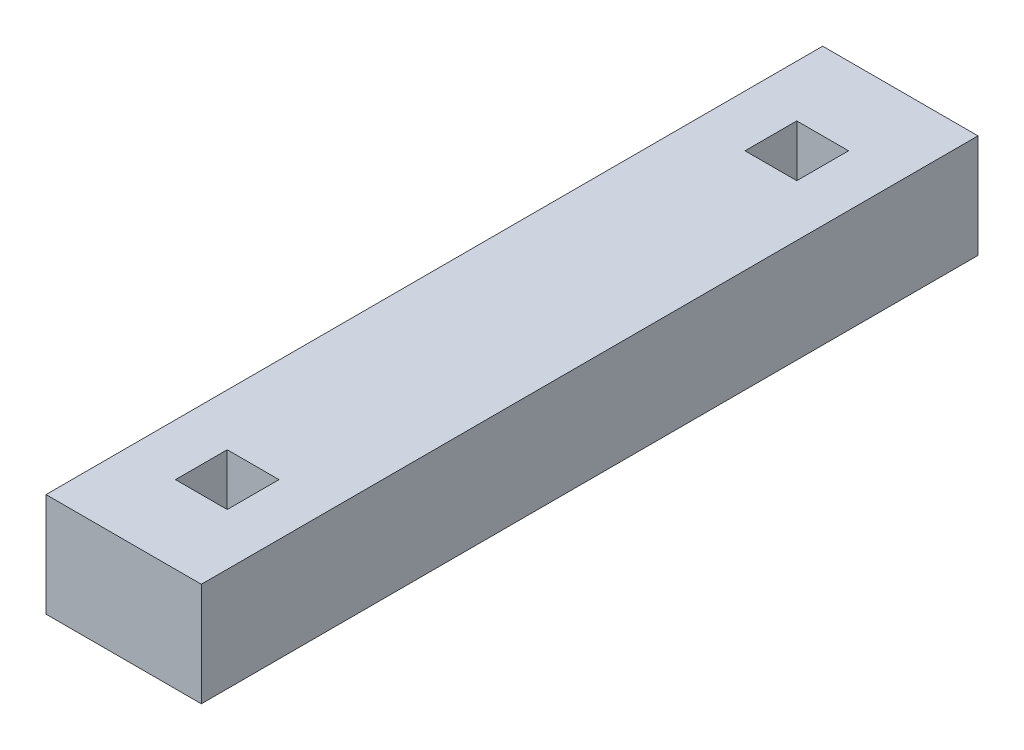
ISO-10303-21;
HEADER;
FILE_DESCRIPTION(('STEP AP214'),'2;1');
FILE_NAME('part.step','',(''),(''),'','','');
FILE_SCHEMA(('AUTOMOTIVE_DESIGN { 1 0 10303 214 1 1 1 1 }'));
ENDSEC;
DATA;
#1=APPLICATION_CONTEXT('core data for automotive mechanical design processes');
#2=APPLICATION_PROTOCOL_DEFINITION('international standard','automotive_design',2000,#1);
#3=PRODUCT_CONTEXT('',#1,'mechanical');
#4=PRODUCT('Part','Part','',(#3));
#5=PRODUCT_RELATED_PRODUCT_CATEGORY('part','',(#4));
#6=PRODUCT_DEFINITION_FORMATION('','',#4);
#7=PRODUCT_DEFINITION_CONTEXT('part definition',#1,'design');
#8=PRODUCT_DEFINITION('design','',#6,#7);
#9=PRODUCT_DEFINITION_SHAPE('','',#8);
#10=(LENGTH_UNIT() NAMED_UNIT(*) SI_UNIT(.MILLI.,.METRE.));
#11=(NAMED_UNIT(*) PLANE_ANGLE_UNIT() SI_UNIT($,.RADIAN.));
#12=(NAMED_UNIT(*) SI_UNIT($,.STERADIAN.) SOLID_ANGLE_UNIT());
#13=UNCERTAINTY_MEASURE_WITH_UNIT(LENGTH_MEASURE(1.E-05),#10,'distance_accuracy_value','');
#14=(GEOMETRIC_REPRESENTATION_CONTEXT(3) GLOBAL_UNCERTAINTY_ASSIGNED_CONTEXT((#13)) GLOBAL_UNIT_ASSIGNED_CONTEXT((#10,
#11,#12)) REPRESENTATION_CONTEXT('',''));
#15=CARTESIAN_POINT('',(0.,0.,0.));
#16=DIRECTION('',(0.,0.,1.));
#17=DIRECTION('',(1.,0.,0.));
#18=AXIS2_PLACEMENT_3D('',#15,#16,#17);
#19=CARTESIAN_POINT('',(0.,20.,0.));
#20=DIRECTION('',(0.,1.,0.));
#21=DIRECTION('',(0.,0.,1.));
#22=AXIS2_PLACEMENT_3D('',#19,#20,#21);
#23=PLANE('',#22);
#24=DIRECTION('',(0.,0.,1.));
#25=VECTOR('',#24,1.);
#26=CARTESIAN_POINT('',(-15.,20.,-70.));
#27=LINE('',#26,#25);
#28=CARTESIAN_POINT('',(-15.,20.,-70.));
#29=VERTEX_POINT('',#28);
#30=CARTESIAN_POINT('',(-15.,20.,80.));
#31=VERTEX_POINT('',#30);
#32=EDGE_CURVE('E189',#29,#31,#27,.T.);
#33=ORIENTED_EDGE('',*,*,#32,.T.);
#34=DIRECTION('',(1.,0.,0.));
#35=VECTOR('',#34,1.);
#36=CARTESIAN_POINT('',(-15.,20.,80.));
#37=LINE('',#36,#35);
#38=CARTESIAN_POINT('',(15.,20.,80.));
#39=VERTEX_POINT('',#38);
#40=EDGE_CURVE('E192',#31,#39,#37,.T.);
#41=ORIENTED_EDGE('',*,*,#40,.T.);
#42=DIRECTION('',(0.,0.,-1.));
#43=VECTOR('',#42,1.);
#44=CARTESIAN_POINT('',(15.,20.,-70.));
#45=LINE('',#44,#43);
#46=CARTESIAN_POINT('',(15.,20.,-70.));
#47=VERTEX_POINT('',#46);
#48=EDGE_CURVE('E195',#39,#47,#45,.T.);
#49=ORIENTED_EDGE('',*,*,#48,.T.);
#50=DIRECTION('',(-1.,0.,0.));
#51=VECTOR('',#50,1.);
#52=CARTESIAN_POINT('',(-15.,20.,-70.));
#53=LINE('',#52,#51);
#54=EDGE_CURVE('E197',#47,#29,#53,.T.);
#55=ORIENTED_EDGE('',*,*,#54,.T.);
#56=EDGE_LOOP('',(#33,#41,#49,#55));
#57=FACE_BOUND('',#56,.T.);
#58=DIRECTION('',(1.,0.,0.));
#59=VECTOR('',#58,1.);
#60=CARTESIAN_POINT('',(-5.,20.,-45.));
#61=LINE('',#60,#59);
#62=CARTESIAN_POINT('',(-5.,20.,-45.));
#63=VERTEX_POINT('',#62);
#64=CARTESIAN_POINT('',(5.,20.,-45.));
#65=VERTEX_POINT('',#64);
#66=EDGE_CURVE('E160',#63,#65,#61,.T.);
#67=ORIENTED_EDGE('',*,*,#66,.F.);
#68=DIRECTION('',(0.,0.,1.));
#69=VECTOR('',#68,1.);
#70=CARTESIAN_POINT('',(-5.,20.,-55.));
#71=LINE('',#70,#69);
#72=CARTESIAN_POINT('',(-5.,20.,-55.));
#73=VERTEX_POINT('',#72);
#74=EDGE_CURVE('E158',#73,#63,#71,.T.);
#75=ORIENTED_EDGE('',*,*,#74,.F.);
#76=DIRECTION('',(-1.,0.,0.));
#77=VECTOR('',#76,1.);
#78=CARTESIAN_POINT('',(-5.,20.,-55.));
#79=LINE('',#78,#77);
#80=CARTESIAN_POINT('',(5.,20.,-55.));
#81=VERTEX_POINT('',#80);
#82=EDGE_CURVE('E166',#81,#73,#79,.T.);
#83=ORIENTED_EDGE('',*,*,#82,.F.);
#84=DIRECTION('',(0.,0.,-1.));
#85=VECTOR('',#84,1.);
#86=CARTESIAN_POINT('',(5.,20.,-55.));
#87=LINE('',#86,#85);
#88=EDGE_CURVE('E163',#65,#81,#87,.T.);
#89=ORIENTED_EDGE('',*,*,#88,.F.);
#90=EDGE_LOOP('',(#67,#75,#83,#89));
#91=FACE_BOUND('',#90,.T.);
#92=DIRECTION('',(0.,0.,-1.));
#93=VECTOR('',#92,1.);
#94=CARTESIAN_POINT('',(5.,20.,65.));
#95=LINE('',#94,#93);
#96=CARTESIAN_POINT('',(5.,20.,65.));
#97=VERTEX_POINT('',#96);
#98=CARTESIAN_POINT('',(5.,20.,55.));
#99=VERTEX_POINT('',#98);
#100=EDGE_CURVE('E130',#97,#99,#95,.T.);
#101=ORIENTED_EDGE('',*,*,#100,.F.);
#102=DIRECTION('',(1.,0.,0.));
#103=VECTOR('',#102,1.);
#104=CARTESIAN_POINT('',(-5.,20.,65.));
#105=LINE('',#104,#103);
#106=CARTESIAN_POINT('',(-5.,20.,65.));
#107=VERTEX_POINT('',#106);
#108=EDGE_CURVE('E122',#107,#97,#105,.T.);
#109=ORIENTED_EDGE('',*,*,#108,.F.);
#110=DIRECTION('',(0.,0.,1.));
#111=VECTOR('',#110,1.);
#112=CARTESIAN_POINT('',(-5.,20.,65.));
#113=LINE('',#112,#111);
#114=CARTESIAN_POINT('',(-5.,20.,55.));
#115=VERTEX_POINT('',#114);
#116=EDGE_CURVE('E144',#115,#107,#113,.T.);
#117=ORIENTED_EDGE('',*,*,#116,.F.);
#118=DIRECTION('',(-1.,0.,0.));
#119=VECTOR('',#118,1.);
#120=CARTESIAN_POINT('',(-5.,20.,55.));
#121=LINE('',#120,#119);
#122=EDGE_CURVE('E142',#99,#115,#121,.T.);
#123=ORIENTED_EDGE('',*,*,#122,.F.);
#124=EDGE_LOOP('',(#101,#109,#117,#123));
#125=FACE_BOUND('',#124,.T.);
#126=ADVANCED_FACE('F33',(#57,#91,#125),#23,.T.);
#127=CARTESIAN_POINT('',(0.,0.,0.));
#128=DIRECTION('',(0.,1.,0.));
#129=DIRECTION('',(0.,0.,1.));
#130=AXIS2_PLACEMENT_3D('',#127,#128,#129);
#131=PLANE('',#130);
#132=DIRECTION('',(0.,0.,1.));
#133=VECTOR('',#132,1.);
#134=CARTESIAN_POINT('',(-5.,0.,-55.));
#135=LINE('',#134,#133);
#136=CARTESIAN_POINT('',(-5.,0.,-55.));
#137=VERTEX_POINT('',#136);
#138=CARTESIAN_POINT('',(-5.,0.,-45.));
#139=VERTEX_POINT('',#138);
#140=EDGE_CURVE('E138',#137,#139,#135,.T.);
#141=ORIENTED_EDGE('',*,*,#140,.T.);
#142=DIRECTION('',(1.,0.,0.));
#143=VECTOR('',#142,1.);
#144=CARTESIAN_POINT('',(-5.,0.,-45.));
#145=LINE('',#144,#143);
#146=CARTESIAN_POINT('',(5.,0.,-45.));
#147=VERTEX_POINT('',#146);
#148=EDGE_CURVE('E171',#139,#147,#145,.T.);
#149=ORIENTED_EDGE('',*,*,#148,.T.);
#150=DIRECTION('',(0.,0.,-1.));
#151=VECTOR('',#150,1.);
#152=CARTESIAN_POINT('',(5.,0.,-55.));
#153=LINE('',#152,#151);
#154=CARTESIAN_POINT('',(5.,0.,-55.));
#155=VERTEX_POINT('',#154);
#156=EDGE_CURVE('E174',#147,#155,#153,.T.);
#157=ORIENTED_EDGE('',*,*,#156,.T.);
#158=DIRECTION('',(-1.,0.,0.));
#159=VECTOR('',#158,1.);
#160=CARTESIAN_POINT('',(-5.,0.,-55.));
#161=LINE('',#160,#159);
#162=EDGE_CURVE('E161',#155,#137,#161,.T.);
#163=ORIENTED_EDGE('',*,*,#162,.T.);
#164=EDGE_LOOP('',(#141,#149,#157,#163));
#165=FACE_BOUND('',#164,.T.);
#166=DIRECTION('',(0.,0.,1.));
#167=VECTOR('',#166,1.);
#168=CARTESIAN_POINT('',(-15.,0.,-70.));
#169=LINE('',#168,#167);
#170=CARTESIAN_POINT('',(-15.,0.,-70.));
#171=VERTEX_POINT('',#170);
#172=CARTESIAN_POINT('',(-15.,0.,80.));
#173=VERTEX_POINT('',#172);
#174=EDGE_CURVE('E188',#171,#173,#169,.T.);
#175=ORIENTED_EDGE('',*,*,#174,.F.);
#176=DIRECTION('',(-1.,0.,0.));
#177=VECTOR('',#176,1.);
#178=CARTESIAN_POINT('',(-15.,0.,-70.));
#179=LINE('',#178,#177);
#180=CARTESIAN_POINT('',(15.,0.,-70.));
#181=VERTEX_POINT('',#180);
#182=EDGE_CURVE('E193',#181,#171,#179,.T.);
#183=ORIENTED_EDGE('',*,*,#182,.F.);
#184=DIRECTION('',(0.,0.,-1.));
#185=VECTOR('',#184,1.);
#186=CARTESIAN_POINT('',(15.,0.,-70.));
#187=LINE('',#186,#185);
#188=CARTESIAN_POINT('',(15.,0.,80.));
#189=VERTEX_POINT('',#188);
#190=EDGE_CURVE('E204',#189,#181,#187,.T.);
#191=ORIENTED_EDGE('',*,*,#190,.F.);
#192=DIRECTION('',(1.,0.,0.));
#193=VECTOR('',#192,1.);
#194=CARTESIAN_POINT('',(-15.,0.,80.));
#195=LINE('',#194,#193);
#196=EDGE_CURVE('E202',#173,#189,#195,.T.);
#197=ORIENTED_EDGE('',*,*,#196,.F.);
#198=EDGE_LOOP('',(#175,#183,#191,#197));
#199=FACE_BOUND('',#198,.T.);
#200=DIRECTION('',(1.,0.,0.));
#201=VECTOR('',#200,1.);
#202=CARTESIAN_POINT('',(-5.,0.,65.));
#203=LINE('',#202,#201);
#204=CARTESIAN_POINT('',(-5.,0.,65.));
#205=VERTEX_POINT('',#204);
#206=CARTESIAN_POINT('',(5.,0.,65.));
#207=VERTEX_POINT('',#206);
#208=EDGE_CURVE('E56',#205,#207,#203,.T.);
#209=ORIENTED_EDGE('',*,*,#208,.T.);
#210=DIRECTION('',(0.,0.,-1.));
#211=VECTOR('',#210,1.);
#212=CARTESIAN_POINT('',(5.,0.,65.));
#213=LINE('',#212,#211);
#214=CARTESIAN_POINT('',(5.,0.,55.));
#215=VERTEX_POINT('',#214);
#216=EDGE_CURVE('E137',#207,#215,#213,.T.);
#217=ORIENTED_EDGE('',*,*,#216,.T.);
#218=DIRECTION('',(-1.,0.,0.));
#219=VECTOR('',#218,1.);
#220=CARTESIAN_POINT('',(-5.,0.,55.));
#221=LINE('',#220,#219);
#222=CARTESIAN_POINT('',(-5.,0.,55.));
#223=VERTEX_POINT('',#222);
#224=EDGE_CURVE('E150',#215,#223,#221,.T.);
#225=ORIENTED_EDGE('',*,*,#224,.T.);
#226=DIRECTION('',(0.,0.,1.));
#227=VECTOR('',#226,1.);
#228=CARTESIAN_POINT('',(-5.,0.,65.));
#229=LINE('',#228,#227);
#230=EDGE_CURVE('E131',#223,#205,#229,.T.);
#231=ORIENTED_EDGE('',*,*,#230,.T.);
#232=EDGE_LOOP('',(#209,#217,#225,#231));
#233=FACE_BOUND('',#232,.T.);
#234=ADVANCED_FACE('F222',(#165,#199,#233),#131,.F.);
#235=CARTESIAN_POINT('',(-15.,20.,-70.));
#236=DIRECTION('',(1.,0.,0.));
#237=DIRECTION('',(0.,0.,-1.));
#238=AXIS2_PLACEMENT_3D('',#235,#236,#237);
#239=PLANE('',#238);
#240=ORIENTED_EDGE('',*,*,#174,.T.);
#241=DIRECTION('',(0.,-1.,0.));
#242=VECTOR('',#241,1.);
#243=CARTESIAN_POINT('',(-15.,20.,80.));
#244=LINE('',#243,#242);
#245=EDGE_CURVE('E11',#31,#173,#244,.T.);
#246=ORIENTED_EDGE('',*,*,#245,.F.);
#247=ORIENTED_EDGE('',*,*,#32,.F.);
#248=DIRECTION('',(0.,-1.,0.));
#249=VECTOR('',#248,1.);
#250=CARTESIAN_POINT('',(-15.,20.,-70.));
#251=LINE('',#250,#249);
#252=EDGE_CURVE('E199',#29,#171,#251,.T.);
#253=ORIENTED_EDGE('',*,*,#252,.T.);
#254=EDGE_LOOP('',(#240,#246,#247,#253));
#255=FACE_BOUND('',#254,.T.);
#256=ADVANCED_FACE('F35',(#255),#239,.F.);
#257=CARTESIAN_POINT('',(-15.,20.,80.));
#258=DIRECTION('',(0.,0.,-1.));
#259=DIRECTION('',(-1.,0.,0.));
#260=AXIS2_PLACEMENT_3D('',#257,#258,#259);
#261=PLANE('',#260);
#262=ORIENTED_EDGE('',*,*,#196,.T.);
#263=DIRECTION('',(0.,-1.,0.));
#264=VECTOR('',#263,1.);
#265=CARTESIAN_POINT('',(15.,20.,80.));
#266=LINE('',#265,#264);
#267=EDGE_CURVE('E41',#39,#189,#266,.T.);
#268=ORIENTED_EDGE('',*,*,#267,.F.);
#269=ORIENTED_EDGE('',*,*,#40,.F.);
#270=ORIENTED_EDGE('',*,*,#245,.T.);
#271=EDGE_LOOP('',(#262,#268,#269,#270));
#272=FACE_BOUND('',#271,.T.);
#273=ADVANCED_FACE('F233',(#272),#261,.F.);
#274=CARTESIAN_POINT('',(15.,20.,-70.));
#275=DIRECTION('',(-1.,0.,0.));
#276=DIRECTION('',(0.,0.,1.));
#277=AXIS2_PLACEMENT_3D('',#274,#275,#276);
#278=PLANE('',#277);
#279=ORIENTED_EDGE('',*,*,#190,.T.);
#280=DIRECTION('',(0.,-1.,0.));
#281=VECTOR('',#280,1.);
#282=CARTESIAN_POINT('',(15.,20.,-70.));
#283=LINE('',#282,#281);
#284=EDGE_CURVE('E209',#47,#181,#283,.T.);
#285=ORIENTED_EDGE('',*,*,#284,.F.);
#286=ORIENTED_EDGE('',*,*,#48,.F.);
#287=ORIENTED_EDGE('',*,*,#267,.T.);
#288=EDGE_LOOP('',(#279,#285,#286,#287));
#289=FACE_BOUND('',#288,.T.);
#290=ADVANCED_FACE('F216',(#289),#278,.F.);
#291=CARTESIAN_POINT('',(-15.,20.,-70.));
#292=DIRECTION('',(0.,0.,1.));
#293=DIRECTION('',(1.,0.,0.));
#294=AXIS2_PLACEMENT_3D('',#291,#292,#293);
#295=PLANE('',#294);
#296=ORIENTED_EDGE('',*,*,#182,.T.);
#297=ORIENTED_EDGE('',*,*,#252,.F.);
#298=ORIENTED_EDGE('',*,*,#54,.F.);
#299=ORIENTED_EDGE('',*,*,#284,.T.);
#300=EDGE_LOOP('',(#296,#297,#298,#299));
#301=FACE_BOUND('',#300,.T.);
#302=ADVANCED_FACE('F226',(#301),#295,.F.);
#303=CARTESIAN_POINT('',(-5.,20.,-55.));
#304=DIRECTION('',(1.,0.,0.));
#305=DIRECTION('',(0.,0.,-1.));
#306=AXIS2_PLACEMENT_3D('',#303,#304,#305);
#307=PLANE('',#306);
#308=ORIENTED_EDGE('',*,*,#140,.F.);
#309=DIRECTION('',(0.,-1.,0.));
#310=VECTOR('',#309,1.);
#311=CARTESIAN_POINT('',(-5.,20.,-55.));
#312=LINE('',#311,#310);
#313=EDGE_CURVE('E168',#73,#137,#312,.T.);
#314=ORIENTED_EDGE('',*,*,#313,.F.);
#315=ORIENTED_EDGE('',*,*,#74,.T.);
#316=DIRECTION('',(0.,-1.,0.));
#317=VECTOR('',#316,1.);
#318=CARTESIAN_POINT('',(-5.,20.,-45.));
#319=LINE('',#318,#317);
#320=EDGE_CURVE('E185',#63,#139,#319,.T.);
#321=ORIENTED_EDGE('',*,*,#320,.T.);
#322=EDGE_LOOP('',(#308,#314,#315,#321));
#323=FACE_BOUND('',#322,.T.);
#324=ADVANCED_FACE('F248',(#323),#307,.T.);
#325=CARTESIAN_POINT('',(-5.,20.,-45.));
#326=DIRECTION('',(0.,0.,-1.));
#327=DIRECTION('',(-1.,0.,0.));
#328=AXIS2_PLACEMENT_3D('',#325,#326,#327);
#329=PLANE('',#328);
#330=ORIENTED_EDGE('',*,*,#148,.F.);
#331=ORIENTED_EDGE('',*,*,#320,.F.);
#332=ORIENTED_EDGE('',*,*,#66,.T.);
#333=DIRECTION('',(0.,-1.,0.));
#334=VECTOR('',#333,1.);
#335=CARTESIAN_POINT('',(5.,20.,-45.));
#336=LINE('',#335,#334);
#337=EDGE_CURVE('E183',#65,#147,#336,.T.);
#338=ORIENTED_EDGE('',*,*,#337,.T.);
#339=EDGE_LOOP('',(#330,#331,#332,#338));
#340=FACE_BOUND('',#339,.T.);
#341=ADVANCED_FACE('F255',(#340),#329,.T.);
#342=CARTESIAN_POINT('',(5.,20.,-55.));
#343=DIRECTION('',(-1.,0.,0.));
#344=DIRECTION('',(0.,0.,1.));
#345=AXIS2_PLACEMENT_3D('',#342,#343,#344);
#346=PLANE('',#345);
#347=ORIENTED_EDGE('',*,*,#156,.F.);
#348=ORIENTED_EDGE('',*,*,#337,.F.);
#349=ORIENTED_EDGE('',*,*,#88,.T.);
#350=DIRECTION('',(0.,-1.,0.));
#351=VECTOR('',#350,1.);
#352=CARTESIAN_POINT('',(5.,20.,-55.));
#353=LINE('',#352,#351);
#354=EDGE_CURVE('E181',#81,#155,#353,.T.);
#355=ORIENTED_EDGE('',*,*,#354,.T.);
#356=EDGE_LOOP('',(#347,#348,#349,#355));
#357=FACE_BOUND('',#356,.T.);
#358=ADVANCED_FACE('F260',(#357),#346,.T.);
#359=CARTESIAN_POINT('',(-5.,20.,-55.));
#360=DIRECTION('',(0.,0.,1.));
#361=DIRECTION('',(1.,0.,0.));
#362=AXIS2_PLACEMENT_3D('',#359,#360,#361);
#363=PLANE('',#362);
#364=ORIENTED_EDGE('',*,*,#162,.F.);
#365=ORIENTED_EDGE('',*,*,#354,.F.);
#366=ORIENTED_EDGE('',*,*,#82,.T.);
#367=ORIENTED_EDGE('',*,*,#313,.T.);
#368=EDGE_LOOP('',(#364,#365,#366,#367));
#369=FACE_BOUND('',#368,.T.);
#370=ADVANCED_FACE('F267',(#369),#363,.T.);
#371=CARTESIAN_POINT('',(-5.,20.,65.));
#372=DIRECTION('',(0.,0.,-1.));
#373=DIRECTION('',(-1.,0.,0.));
#374=AXIS2_PLACEMENT_3D('',#371,#372,#373);
#375=PLANE('',#374);
#376=ORIENTED_EDGE('',*,*,#208,.F.);
#377=DIRECTION('',(0.,-1.,0.));
#378=VECTOR('',#377,1.);
#379=CARTESIAN_POINT('',(-5.,20.,65.));
#380=LINE('',#379,#378);
#381=EDGE_CURVE('E126',#107,#205,#380,.T.);
#382=ORIENTED_EDGE('',*,*,#381,.F.);
#383=ORIENTED_EDGE('',*,*,#108,.T.);
#384=DIRECTION('',(0.,-1.,0.));
#385=VECTOR('',#384,1.);
#386=CARTESIAN_POINT('',(5.,20.,65.));
#387=LINE('',#386,#385);
#388=EDGE_CURVE('E125',#97,#207,#387,.T.);
#389=ORIENTED_EDGE('',*,*,#388,.T.);
#390=EDGE_LOOP('',(#376,#382,#383,#389));
#391=FACE_BOUND('',#390,.T.);
#392=ADVANCED_FACE('F124',(#391),#375,.T.);
#393=CARTESIAN_POINT('',(5.,20.,65.));
#394=DIRECTION('',(-1.,0.,0.));
#395=DIRECTION('',(0.,0.,1.));
#396=AXIS2_PLACEMENT_3D('',#393,#394,#395);
#397=PLANE('',#396);
#398=ORIENTED_EDGE('',*,*,#216,.F.);
#399=ORIENTED_EDGE('',*,*,#388,.F.);
#400=ORIENTED_EDGE('',*,*,#100,.T.);
#401=DIRECTION('',(0.,-1.,0.));
#402=VECTOR('',#401,1.);
#403=CARTESIAN_POINT('',(5.,20.,55.));
#404=LINE('',#403,#402);
#405=EDGE_CURVE('E139',#99,#215,#404,.T.);
#406=ORIENTED_EDGE('',*,*,#405,.T.);
#407=EDGE_LOOP('',(#398,#399,#400,#406));
#408=FACE_BOUND('',#407,.T.);
#409=ADVANCED_FACE('F134',(#408),#397,.T.);
#410=CARTESIAN_POINT('',(-5.,20.,55.));
#411=DIRECTION('',(0.,0.,1.));
#412=DIRECTION('',(1.,0.,0.));
#413=AXIS2_PLACEMENT_3D('',#410,#411,#412);
#414=PLANE('',#413);
#415=ORIENTED_EDGE('',*,*,#224,.F.);
#416=ORIENTED_EDGE('',*,*,#405,.F.);
#417=ORIENTED_EDGE('',*,*,#122,.T.);
#418=DIRECTION('',(0.,-1.,0.));
#419=VECTOR('',#418,1.);
#420=CARTESIAN_POINT('',(-5.,20.,55.));
#421=LINE('',#420,#419);
#422=EDGE_CURVE('E48',#115,#223,#421,.T.);
#423=ORIENTED_EDGE('',*,*,#422,.T.);
#424=EDGE_LOOP('',(#415,#416,#417,#423));
#425=FACE_BOUND('',#424,.T.);
#426=ADVANCED_FACE('F285',(#425),#414,.T.);
#427=CARTESIAN_POINT('',(-5.,20.,65.));
#428=DIRECTION('',(1.,0.,0.));
#429=DIRECTION('',(0.,0.,-1.));
#430=AXIS2_PLACEMENT_3D('',#427,#428,#429);
#431=PLANE('',#430);
#432=ORIENTED_EDGE('',*,*,#230,.F.);
#433=ORIENTED_EDGE('',*,*,#422,.F.);
#434=ORIENTED_EDGE('',*,*,#116,.T.);
#435=ORIENTED_EDGE('',*,*,#381,.T.);
#436=EDGE_LOOP('',(#432,#433,#434,#435));
#437=FACE_BOUND('',#436,.T.);
#438=ADVANCED_FACE('F288',(#437),#431,.T.);
#439=CLOSED_SHELL('',(#126,#234,#256,#273,#290,#302,#324,#341,#358,#370,#392,#409,#426,#438));
#440=MANIFOLD_SOLID_BREP('B2',#439);
#441=ADVANCED_BREP_SHAPE_REPRESENTATION('',(#18,#440),#14);
#442=SHAPE_DEFINITION_REPRESENTATION(#9,#441);
ENDSEC;
END-ISO-10303-21;
